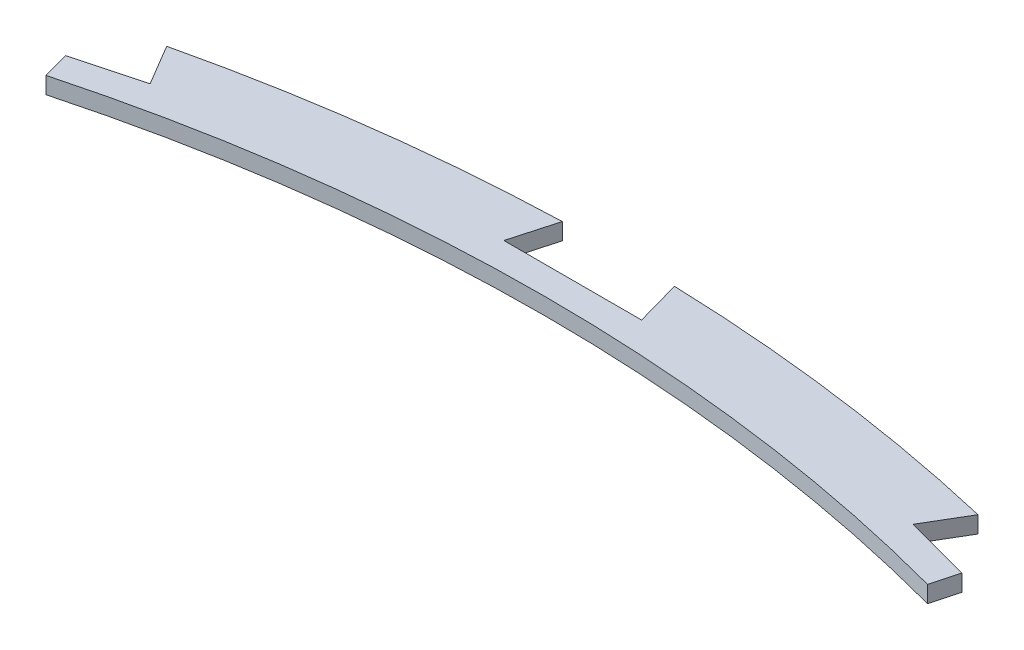
ISO-10303-21;
HEADER;
FILE_DESCRIPTION(('STEP AP214'),'2;1');
FILE_NAME('part.step','',(''),(''),'','','');
FILE_SCHEMA(('AUTOMOTIVE_DESIGN { 1 0 10303 214 1 1 1 1 }'));
ENDSEC;
DATA;
#1=APPLICATION_CONTEXT('core data for automotive mechanical design processes');
#2=APPLICATION_PROTOCOL_DEFINITION('international standard','automotive_design',2000,#1);
#3=PRODUCT_CONTEXT('',#1,'mechanical');
#4=PRODUCT('Part','Part','',(#3));
#5=PRODUCT_RELATED_PRODUCT_CATEGORY('part','',(#4));
#6=PRODUCT_DEFINITION_FORMATION('','',#4);
#7=PRODUCT_DEFINITION_CONTEXT('part definition',#1,'design');
#8=PRODUCT_DEFINITION('design','',#6,#7);
#9=PRODUCT_DEFINITION_SHAPE('','',#8);
#10=(LENGTH_UNIT() NAMED_UNIT(*) SI_UNIT(.MILLI.,.METRE.));
#11=(NAMED_UNIT(*) PLANE_ANGLE_UNIT() SI_UNIT($,.RADIAN.));
#12=(NAMED_UNIT(*) SI_UNIT($,.STERADIAN.) SOLID_ANGLE_UNIT());
#13=UNCERTAINTY_MEASURE_WITH_UNIT(LENGTH_MEASURE(1.E-05),#10,'distance_accuracy_value','');
#14=(GEOMETRIC_REPRESENTATION_CONTEXT(3) GLOBAL_UNCERTAINTY_ASSIGNED_CONTEXT((#13)) GLOBAL_UNIT_ASSIGNED_CONTEXT((#10,
#11,#12)) REPRESENTATION_CONTEXT('',''));
#15=CARTESIAN_POINT('',(0.,0.,0.));
#16=DIRECTION('',(0.,0.,1.));
#17=DIRECTION('',(1.,0.,0.));
#18=AXIS2_PLACEMENT_3D('',#15,#16,#17);
#19=CARTESIAN_POINT('',(0.,9.00000000000001,0.));
#20=DIRECTION('',(0.,-1.,0.));
#21=DIRECTION('',(0.,0.,-1.));
#22=AXIS2_PLACEMENT_3D('',#19,#20,#21);
#23=CYLINDRICAL_SURFACE('',#22,915.);
#24=CARTESIAN_POINT('',(0.,0.,0.));
#25=DIRECTION('',(0.,1.,0.));
#26=DIRECTION('',(0.,0.,1.));
#27=AXIS2_PLACEMENT_3D('',#24,#25,#26);
#28=CIRCLE('',#27,915.);
#29=CARTESIAN_POINT('',(236.819426268801,0.,-883.822131054499));
#30=VERTEX_POINT('',#29);
#31=CARTESIAN_POINT('',(-236.819426268801,0.,-883.822131054499));
#32=VERTEX_POINT('',#31);
#33=EDGE_CURVE('E174',#30,#32,#28,.T.);
#34=ORIENTED_EDGE('',*,*,#33,.F.);
#35=DIRECTION('',(0.,-1.,0.));
#36=VECTOR('',#35,1.);
#37=CARTESIAN_POINT('',(236.819426268801,9.00000000000001,-883.822131054499));
#38=LINE('',#37,#36);
#39=CARTESIAN_POINT('',(236.819426268801,9.00000000000001,-883.822131054499));
#40=VERTEX_POINT('',#39);
#41=EDGE_CURVE('E11',#40,#30,#38,.T.);
#42=ORIENTED_EDGE('',*,*,#41,.F.);
#43=CARTESIAN_POINT('',(0.,9.00000000000001,0.));
#44=DIRECTION('',(0.,1.,0.));
#45=DIRECTION('',(0.,0.,1.));
#46=AXIS2_PLACEMENT_3D('',#43,#44,#45);
#47=CIRCLE('',#46,915.);
#48=CARTESIAN_POINT('',(-236.819426268801,9.00000000000001,-883.822131054499));
#49=VERTEX_POINT('',#48);
#50=EDGE_CURVE('E211',#40,#49,#47,.T.);
#51=ORIENTED_EDGE('',*,*,#50,.T.);
#52=DIRECTION('',(0.,-1.,0.));
#53=VECTOR('',#52,1.);
#54=CARTESIAN_POINT('',(-236.819426268801,9.00000000000001,-883.822131054499));
#55=LINE('',#54,#53);
#56=EDGE_CURVE('E68',#49,#32,#55,.T.);
#57=ORIENTED_EDGE('',*,*,#56,.T.);
#58=EDGE_LOOP('',(#34,#42,#51,#57));
#59=FACE_BOUND('',#58,.T.);
#60=ADVANCED_FACE('F51',(#59),#23,.F.);
#61=CARTESIAN_POINT('',(0.,9.00000000000001,0.));
#62=DIRECTION('',(-0.96592582628907,0.,-0.258819045102515));
#63=DIRECTION('',(-0.258819045102515,0.,0.96592582628907));
#64=AXIS2_PLACEMENT_3D('',#61,#62,#63);
#65=PLANE('',#64);
#66=DIRECTION('',(0.258819045102515,0.,-0.96592582628907));
#67=VECTOR('',#66,1.);
#68=CARTESIAN_POINT('',(0.,0.,0.));
#69=LINE('',#68,#67);
#70=CARTESIAN_POINT('',(240.701711945339,0.,-898.311018448835));
#71=VERTEX_POINT('',#70);
#72=EDGE_CURVE('E177',#30,#71,#69,.T.);
#73=ORIENTED_EDGE('',*,*,#72,.T.);
#74=DIRECTION('',(0.,-1.,0.));
#75=VECTOR('',#74,1.);
#76=CARTESIAN_POINT('',(240.701711945339,9.00000000000001,-898.311018448835));
#77=LINE('',#76,#75);
#78=CARTESIAN_POINT('',(240.701711945339,9.00000000000001,-898.311018448835));
#79=VERTEX_POINT('',#78);
#80=EDGE_CURVE('E60',#79,#71,#77,.T.);
#81=ORIENTED_EDGE('',*,*,#80,.F.);
#82=DIRECTION('',(0.258819045102515,0.,-0.96592582628907));
#83=VECTOR('',#82,1.);
#84=CARTESIAN_POINT('',(0.,9.00000000000001,0.));
#85=LINE('',#84,#83);
#86=EDGE_CURVE('E440',#40,#79,#85,.T.);
#87=ORIENTED_EDGE('',*,*,#86,.F.);
#88=ORIENTED_EDGE('',*,*,#41,.T.);
#89=EDGE_LOOP('',(#73,#81,#87,#88));
#90=FACE_BOUND('',#89,.T.);
#91=ADVANCED_FACE('F312',(#90),#65,.F.);
#92=CARTESIAN_POINT('',(240.701711945335,9.00000000000001,-898.311018448836));
#93=DIRECTION('',(-0.25881904510251,0.,0.965925826289071));
#94=DIRECTION('',(0.965925826289071,0.,0.258819045102511));
#95=AXIS2_PLACEMENT_3D('',#92,#93,#94);
#96=PLANE('',#95);
#97=DIRECTION('',(-0.965925826289071,0.,-0.258819045102511));
#98=VECTOR('',#97,1.);
#99=CARTESIAN_POINT('',(240.701711945335,0.,-898.311018448836));
#100=LINE('',#99,#98);
#101=CARTESIAN_POINT('',(204.962456372643,0.,-907.887323117628));
#102=VERTEX_POINT('',#101);
#103=EDGE_CURVE('E180',#71,#102,#100,.T.);
#104=ORIENTED_EDGE('',*,*,#103,.T.);
#105=DIRECTION('',(0.,-1.,0.));
#106=VECTOR('',#105,1.);
#107=CARTESIAN_POINT('',(204.962456372643,9.00000000000001,-907.887323117628));
#108=LINE('',#107,#106);
#109=CARTESIAN_POINT('',(204.962456372643,9.00000000000001,-907.887323117628));
#110=VERTEX_POINT('',#109);
#111=EDGE_CURVE('E235',#110,#102,#108,.T.);
#112=ORIENTED_EDGE('',*,*,#111,.F.);
#113=DIRECTION('',(-0.965925826289071,0.,-0.258819045102511));
#114=VECTOR('',#113,1.);
#115=CARTESIAN_POINT('',(240.701711945335,9.00000000000001,-898.311018448836));
#116=LINE('',#115,#114);
#117=EDGE_CURVE('E247',#79,#110,#116,.T.);
#118=ORIENTED_EDGE('',*,*,#117,.F.);
#119=ORIENTED_EDGE('',*,*,#80,.T.);
#120=EDGE_LOOP('',(#104,#112,#118,#119));
#121=FACE_BOUND('',#120,.T.);
#122=ADVANCED_FACE('F245',(#121),#96,.F.);
#123=CARTESIAN_POINT('',(-246.396477387418,9.00000000000001,-145.963797681964));
#124=DIRECTION('',(-0.860366456574925,0.,-0.50967593665064));
#125=DIRECTION('',(-0.50967593665064,0.,0.860366456574925));
#126=AXIS2_PLACEMENT_3D('',#123,#124,#125);
#127=PLANE('',#126);
#128=DIRECTION('',(0.50967593665064,0.,-0.860366456574925));
#129=VECTOR('',#128,1.);
#130=CARTESIAN_POINT('',(-246.396477387418,0.,-145.963797681964));
#131=LINE('',#130,#129);
#132=CARTESIAN_POINT('',(217.942733847983,0.,-929.798884040451));
#133=VERTEX_POINT('',#132);
#134=EDGE_CURVE('E183',#102,#133,#131,.T.);
#135=ORIENTED_EDGE('',*,*,#134,.T.);
#136=DIRECTION('',(0.,-1.,0.));
#137=VECTOR('',#136,1.);
#138=CARTESIAN_POINT('',(217.942733847983,9.00000000000001,-929.798884040451));
#139=LINE('',#138,#137);
#140=CARTESIAN_POINT('',(217.942733847983,9.00000000000001,-929.798884040451));
#141=VERTEX_POINT('',#140);
#142=EDGE_CURVE('E231',#141,#133,#139,.T.);
#143=ORIENTED_EDGE('',*,*,#142,.F.);
#144=DIRECTION('',(0.50967593665064,0.,-0.860366456574925));
#145=VECTOR('',#144,1.);
#146=CARTESIAN_POINT('',(-246.396477387418,9.00000000000001,-145.963797681964));
#147=LINE('',#146,#145);
#148=EDGE_CURVE('E267',#110,#141,#147,.T.);
#149=ORIENTED_EDGE('',*,*,#148,.F.);
#150=ORIENTED_EDGE('',*,*,#111,.T.);
#151=EDGE_LOOP('',(#135,#143,#149,#150));
#152=FACE_BOUND('',#151,.T.);
#153=ADVANCED_FACE('F256',(#152),#127,.F.);
#154=CARTESIAN_POINT('',(0.,9.00000000000001,0.));
#155=DIRECTION('',(0.,-1.,0.));
#156=DIRECTION('',(0.,0.,-1.));
#157=AXIS2_PLACEMENT_3D('',#154,#155,#156);
#158=CYLINDRICAL_SURFACE('',#157,955.);
#159=CARTESIAN_POINT('',(0.,0.,0.));
#160=DIRECTION('',(0.,1.,0.));
#161=DIRECTION('',(0.,0.,1.));
#162=AXIS2_PLACEMENT_3D('',#159,#160,#161);
#163=CIRCLE('',#162,955.);
#164=CARTESIAN_POINT('',(30.1331440289217,0.,-954.524485610994));
#165=VERTEX_POINT('',#164);
#166=EDGE_CURVE('E186',#133,#165,#163,.T.);
#167=ORIENTED_EDGE('',*,*,#166,.T.);
#168=DIRECTION('',(0.,-1.,0.));
#169=VECTOR('',#168,1.);
#170=CARTESIAN_POINT('',(30.1331440289217,9.00000000000001,-954.524485610994));
#171=LINE('',#170,#169);
#172=CARTESIAN_POINT('',(30.1331440289217,9.00000000000001,-954.524485610994));
#173=VERTEX_POINT('',#172);
#174=EDGE_CURVE('E228',#173,#165,#171,.T.);
#175=ORIENTED_EDGE('',*,*,#174,.F.);
#176=CARTESIAN_POINT('',(0.,9.00000000000001,0.));
#177=DIRECTION('',(0.,1.,0.));
#178=DIRECTION('',(0.,0.,1.));
#179=AXIS2_PLACEMENT_3D('',#176,#177,#178);
#180=CIRCLE('',#179,955.);
#181=EDGE_CURVE('E262',#141,#173,#180,.T.);
#182=ORIENTED_EDGE('',*,*,#181,.F.);
#183=ORIENTED_EDGE('',*,*,#142,.T.);
#184=EDGE_LOOP('',(#167,#175,#182,#183));
#185=FACE_BOUND('',#184,.T.);
#186=ADVANCED_FACE('F260',(#185),#158,.T.);
#187=CARTESIAN_POINT('',(275.778931750743,9.00000000000001,-77.2181008902084));
#188=DIRECTION('',(-0.962964019714181,0.,0.269629925519972));
#189=DIRECTION('',(0.269629925519972,0.,0.962964019714182));
#190=AXIS2_PLACEMENT_3D('',#187,#188,#189);
#191=PLANE('',#190);
#192=DIRECTION('',(-0.269629925519972,0.,-0.962964019714182));
#193=VECTOR('',#192,1.);
#194=CARTESIAN_POINT('',(275.778931750743,0.,-77.2181008902084));
#195=LINE('',#194,#193);
#196=CARTESIAN_POINT('',(37.,0.,-930.));
#197=VERTEX_POINT('',#196);
#198=EDGE_CURVE('E190',#197,#165,#195,.T.);
#199=ORIENTED_EDGE('',*,*,#198,.F.);
#200=DIRECTION('',(0.,-1.,0.));
#201=VECTOR('',#200,1.);
#202=CARTESIAN_POINT('',(37.,9.00000000000001,-930.));
#203=LINE('',#202,#201);
#204=CARTESIAN_POINT('',(37.,9.00000000000001,-930.));
#205=VERTEX_POINT('',#204);
#206=EDGE_CURVE('E225',#205,#197,#203,.T.);
#207=ORIENTED_EDGE('',*,*,#206,.F.);
#208=DIRECTION('',(-0.269629925519972,0.,-0.962964019714182));
#209=VECTOR('',#208,1.);
#210=CARTESIAN_POINT('',(275.778931750743,9.00000000000001,-77.2181008902084));
#211=LINE('',#210,#209);
#212=EDGE_CURVE('E266',#205,#173,#211,.T.);
#213=ORIENTED_EDGE('',*,*,#212,.T.);
#214=ORIENTED_EDGE('',*,*,#174,.T.);
#215=EDGE_LOOP('',(#199,#207,#213,#214));
#216=FACE_BOUND('',#215,.T.);
#217=ADVANCED_FACE('F292',(#216),#191,.T.);
#218=CARTESIAN_POINT('',(0.,9.00000000000001,-930.));
#219=DIRECTION('',(0.,0.,-1.));
#220=DIRECTION('',(-1.,0.,0.));
#221=AXIS2_PLACEMENT_3D('',#218,#219,#220);
#222=PLANE('',#221);
#223=DIRECTION('',(1.,0.,0.));
#224=VECTOR('',#223,1.);
#225=CARTESIAN_POINT('',(0.,0.,-930.));
#226=LINE('',#225,#224);
#227=CARTESIAN_POINT('',(-37.,0.,-930.));
#228=VERTEX_POINT('',#227);
#229=EDGE_CURVE('E195',#228,#197,#226,.T.);
#230=ORIENTED_EDGE('',*,*,#229,.F.);
#231=DIRECTION('',(0.,-1.,0.));
#232=VECTOR('',#231,1.);
#233=CARTESIAN_POINT('',(-37.,9.00000000000001,-930.));
#234=LINE('',#233,#232);
#235=CARTESIAN_POINT('',(-37.,9.00000000000001,-930.));
#236=VERTEX_POINT('',#235);
#237=EDGE_CURVE('E222',#236,#228,#234,.T.);
#238=ORIENTED_EDGE('',*,*,#237,.F.);
#239=DIRECTION('',(1.,0.,0.));
#240=VECTOR('',#239,1.);
#241=CARTESIAN_POINT('',(0.,9.00000000000001,-930.));
#242=LINE('',#241,#240);
#243=EDGE_CURVE('E272',#236,#205,#242,.T.);
#244=ORIENTED_EDGE('',*,*,#243,.T.);
#245=ORIENTED_EDGE('',*,*,#206,.T.);
#246=EDGE_LOOP('',(#230,#238,#244,#245));
#247=FACE_BOUND('',#246,.T.);
#248=ADVANCED_FACE('F289',(#247),#222,.T.);
#249=CARTESIAN_POINT('',(-275.778931750742,9.00000000000001,-77.218100890208));
#250=DIRECTION('',(-0.962964019714182,0.,-0.269629925519972));
#251=DIRECTION('',(-0.269629925519972,0.,0.962964019714182));
#252=AXIS2_PLACEMENT_3D('',#249,#250,#251);
#253=PLANE('',#252);
#254=DIRECTION('',(0.269629925519972,0.,-0.962964019714182));
#255=VECTOR('',#254,1.);
#256=CARTESIAN_POINT('',(-275.778931750742,0.,-77.218100890208));
#257=LINE('',#256,#255);
#258=CARTESIAN_POINT('',(-30.1331440289217,0.,-954.524485610994));
#259=VERTEX_POINT('',#258);
#260=EDGE_CURVE('E199',#228,#259,#257,.T.);
#261=ORIENTED_EDGE('',*,*,#260,.T.);
#262=DIRECTION('',(0.,-1.,0.));
#263=VECTOR('',#262,1.);
#264=CARTESIAN_POINT('',(-30.1331440289217,9.00000000000001,-954.524485610994));
#265=LINE('',#264,#263);
#266=CARTESIAN_POINT('',(-30.1331440289217,9.00000000000001,-954.524485610994));
#267=VERTEX_POINT('',#266);
#268=EDGE_CURVE('E218',#267,#259,#265,.T.);
#269=ORIENTED_EDGE('',*,*,#268,.F.);
#270=DIRECTION('',(0.269629925519972,0.,-0.962964019714182));
#271=VECTOR('',#270,1.);
#272=CARTESIAN_POINT('',(-275.778931750742,9.00000000000001,-77.218100890208));
#273=LINE('',#272,#271);
#274=EDGE_CURVE('E276',#236,#267,#273,.T.);
#275=ORIENTED_EDGE('',*,*,#274,.F.);
#276=ORIENTED_EDGE('',*,*,#237,.T.);
#277=EDGE_LOOP('',(#261,#269,#275,#276));
#278=FACE_BOUND('',#277,.T.);
#279=ADVANCED_FACE('F297',(#278),#253,.F.);
#280=CARTESIAN_POINT('',(-217.942733847983,0.,-929.798884040451));
#281=VERTEX_POINT('',#280);
#282=EDGE_CURVE('E191',#259,#281,#163,.T.);
#283=ORIENTED_EDGE('',*,*,#282,.T.);
#284=DIRECTION('',(0.,-1.,0.));
#285=VECTOR('',#284,1.);
#286=CARTESIAN_POINT('',(-217.942733847983,9.00000000000001,-929.798884040451));
#287=LINE('',#286,#285);
#288=CARTESIAN_POINT('',(-217.942733847983,9.00000000000001,-929.798884040451));
#289=VERTEX_POINT('',#288);
#290=EDGE_CURVE('E152',#289,#281,#287,.T.);
#291=ORIENTED_EDGE('',*,*,#290,.F.);
#292=EDGE_CURVE('E161',#267,#289,#180,.T.);
#293=ORIENTED_EDGE('',*,*,#292,.F.);
#294=ORIENTED_EDGE('',*,*,#268,.T.);
#295=EDGE_LOOP('',(#283,#291,#293,#294));
#296=FACE_BOUND('',#295,.T.);
#297=ADVANCED_FACE('F299',(#296),#158,.T.);
#298=CARTESIAN_POINT('',(246.396477387418,9.00000000000001,-145.963797681964));
#299=DIRECTION('',(-0.860366456574925,0.,0.50967593665064));
#300=DIRECTION('',(0.50967593665064,0.,0.860366456574925));
#301=AXIS2_PLACEMENT_3D('',#298,#299,#300);
#302=PLANE('',#301);
#303=DIRECTION('',(-0.50967593665064,0.,-0.860366456574925));
#304=VECTOR('',#303,1.);
#305=CARTESIAN_POINT('',(246.396477387418,0.,-145.963797681964));
#306=LINE('',#305,#304);
#307=CARTESIAN_POINT('',(-204.962456372643,0.,-907.887323117628));
#308=VERTEX_POINT('',#307);
#309=EDGE_CURVE('E147',#308,#281,#306,.T.);
#310=ORIENTED_EDGE('',*,*,#309,.F.);
#311=DIRECTION('',(0.,-1.,0.));
#312=VECTOR('',#311,1.);
#313=CARTESIAN_POINT('',(-204.962456372643,9.00000000000001,-907.887323117628));
#314=LINE('',#313,#312);
#315=CARTESIAN_POINT('',(-204.962456372643,9.00000000000001,-907.887323117628));
#316=VERTEX_POINT('',#315);
#317=EDGE_CURVE('E142',#316,#308,#314,.T.);
#318=ORIENTED_EDGE('',*,*,#317,.F.);
#319=DIRECTION('',(-0.50967593665064,0.,-0.860366456574925));
#320=VECTOR('',#319,1.);
#321=CARTESIAN_POINT('',(246.396477387418,9.00000000000001,-145.963797681964));
#322=LINE('',#321,#320);
#323=EDGE_CURVE('E145',#316,#289,#322,.T.);
#324=ORIENTED_EDGE('',*,*,#323,.T.);
#325=ORIENTED_EDGE('',*,*,#290,.T.);
#326=EDGE_LOOP('',(#310,#318,#324,#325));
#327=FACE_BOUND('',#326,.T.);
#328=ADVANCED_FACE('F144',(#327),#302,.T.);
#329=CARTESIAN_POINT('',(-240.701711945338,9.00000000000001,-898.311018448835));
#330=DIRECTION('',(-0.258819045102514,0.,-0.96592582628907));
#331=DIRECTION('',(-0.96592582628907,0.,0.258819045102514));
#332=AXIS2_PLACEMENT_3D('',#329,#330,#331);
#333=PLANE('',#332);
#334=DIRECTION('',(0.96592582628907,0.,-0.258819045102514));
#335=VECTOR('',#334,1.);
#336=CARTESIAN_POINT('',(-240.701711945338,0.,-898.311018448835));
#337=LINE('',#336,#335);
#338=CARTESIAN_POINT('',(-240.701711945339,0.,-898.311018448835));
#339=VERTEX_POINT('',#338);
#340=EDGE_CURVE('E204',#339,#308,#337,.T.);
#341=ORIENTED_EDGE('',*,*,#340,.F.);
#342=DIRECTION('',(0.,-1.,0.));
#343=VECTOR('',#342,1.);
#344=CARTESIAN_POINT('',(-240.701711945339,9.00000000000001,-898.311018448835));
#345=LINE('',#344,#343);
#346=CARTESIAN_POINT('',(-240.701711945339,9.00000000000001,-898.311018448835));
#347=VERTEX_POINT('',#346);
#348=EDGE_CURVE('E105',#347,#339,#345,.T.);
#349=ORIENTED_EDGE('',*,*,#348,.F.);
#350=DIRECTION('',(0.96592582628907,0.,-0.258819045102514));
#351=VECTOR('',#350,1.);
#352=CARTESIAN_POINT('',(-240.701711945338,9.00000000000001,-898.311018448835));
#353=LINE('',#352,#351);
#354=EDGE_CURVE('E159',#347,#316,#353,.T.);
#355=ORIENTED_EDGE('',*,*,#354,.T.);
#356=ORIENTED_EDGE('',*,*,#317,.T.);
#357=EDGE_LOOP('',(#341,#349,#355,#356));
#358=FACE_BOUND('',#357,.T.);
#359=ADVANCED_FACE('F165',(#358),#333,.T.);
#360=CARTESIAN_POINT('',(0.,9.00000000000001,0.));
#361=DIRECTION('',(-0.96592582628907,0.,0.258819045102515));
#362=DIRECTION('',(0.258819045102515,0.,0.96592582628907));
#363=AXIS2_PLACEMENT_3D('',#360,#361,#362);
#364=PLANE('',#363);
#365=DIRECTION('',(-0.258819045102515,0.,-0.96592582628907));
#366=VECTOR('',#365,1.);
#367=CARTESIAN_POINT('',(0.,0.,0.));
#368=LINE('',#367,#366);
#369=EDGE_CURVE('E207',#32,#339,#368,.T.);
#370=ORIENTED_EDGE('',*,*,#369,.F.);
#371=ORIENTED_EDGE('',*,*,#56,.F.);
#372=DIRECTION('',(-0.258819045102515,0.,-0.96592582628907));
#373=VECTOR('',#372,1.);
#374=CARTESIAN_POINT('',(0.,9.00000000000001,0.));
#375=LINE('',#374,#373);
#376=EDGE_CURVE('E167',#49,#347,#375,.T.);
#377=ORIENTED_EDGE('',*,*,#376,.T.);
#378=ORIENTED_EDGE('',*,*,#348,.T.);
#379=EDGE_LOOP('',(#370,#371,#377,#378));
#380=FACE_BOUND('',#379,.T.);
#381=ADVANCED_FACE('F301',(#380),#364,.T.);
#382=CARTESIAN_POINT('',(0.,9.00000000000001,0.));
#383=DIRECTION('',(0.,1.,0.));
#384=DIRECTION('',(0.,0.,1.));
#385=AXIS2_PLACEMENT_3D('',#382,#383,#384);
#386=PLANE('',#385);
#387=ORIENTED_EDGE('',*,*,#50,.F.);
#388=ORIENTED_EDGE('',*,*,#86,.T.);
#389=ORIENTED_EDGE('',*,*,#117,.T.);
#390=ORIENTED_EDGE('',*,*,#148,.T.);
#391=ORIENTED_EDGE('',*,*,#181,.T.);
#392=ORIENTED_EDGE('',*,*,#212,.F.);
#393=ORIENTED_EDGE('',*,*,#243,.F.);
#394=ORIENTED_EDGE('',*,*,#274,.T.);
#395=ORIENTED_EDGE('',*,*,#292,.T.);
#396=ORIENTED_EDGE('',*,*,#323,.F.);
#397=ORIENTED_EDGE('',*,*,#354,.F.);
#398=ORIENTED_EDGE('',*,*,#376,.F.);
#399=EDGE_LOOP('',(#387,#388,#389,#390,#391,#392,#393,#394,#395,#396,#397,#398));
#400=FACE_BOUND('',#399,.T.);
#401=ADVANCED_FACE('F157',(#400),#386,.T.);
#402=CARTESIAN_POINT('',(0.,0.,0.));
#403=DIRECTION('',(0.,1.,0.));
#404=DIRECTION('',(0.,0.,1.));
#405=AXIS2_PLACEMENT_3D('',#402,#403,#404);
#406=PLANE('',#405);
#407=ORIENTED_EDGE('',*,*,#33,.T.);
#408=ORIENTED_EDGE('',*,*,#369,.T.);
#409=ORIENTED_EDGE('',*,*,#340,.T.);
#410=ORIENTED_EDGE('',*,*,#309,.T.);
#411=ORIENTED_EDGE('',*,*,#282,.F.);
#412=ORIENTED_EDGE('',*,*,#260,.F.);
#413=ORIENTED_EDGE('',*,*,#229,.T.);
#414=ORIENTED_EDGE('',*,*,#198,.T.);
#415=ORIENTED_EDGE('',*,*,#166,.F.);
#416=ORIENTED_EDGE('',*,*,#134,.F.);
#417=ORIENTED_EDGE('',*,*,#103,.F.);
#418=ORIENTED_EDGE('',*,*,#72,.F.);
#419=EDGE_LOOP('',(#407,#408,#409,#410,#411,#412,#413,#414,#415,#416,#417,#418));
#420=FACE_BOUND('',#419,.T.);
#421=ADVANCED_FACE('F252',(#420),#406,.F.);
#422=CLOSED_SHELL('',(#60,#91,#122,#153,#186,#217,#248,#279,#297,#328,#359,#381,#401,#421));
#423=MANIFOLD_SOLID_BREP('B2',#422);
#424=ADVANCED_BREP_SHAPE_REPRESENTATION('',(#18,#423),#14);
#425=SHAPE_DEFINITION_REPRESENTATION(#9,#424);
ENDSEC;
END-ISO-10303-21;
